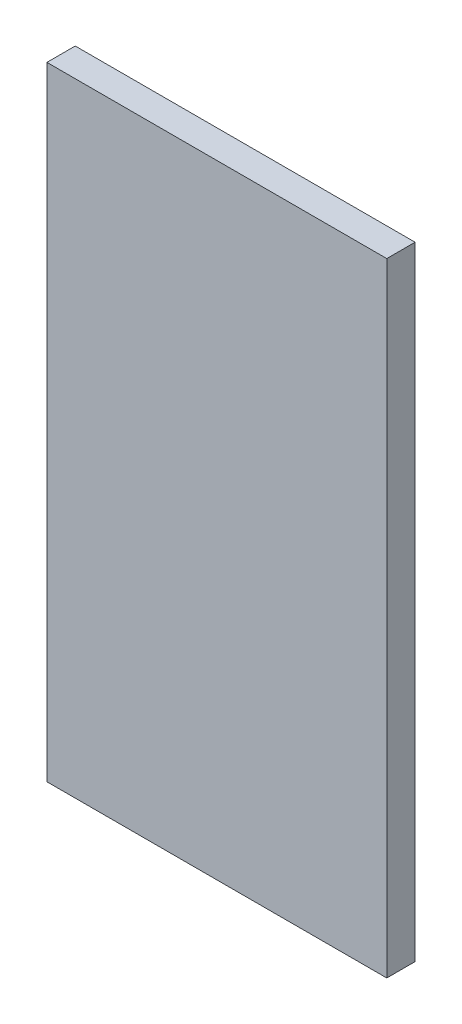
ISO-10303-21;
HEADER;
FILE_DESCRIPTION(('STEP AP214'),'2;1');
FILE_NAME('part.step','',(''),(''),'','','');
FILE_SCHEMA(('AUTOMOTIVE_DESIGN { 1 0 10303 214 1 1 1 1 }'));
ENDSEC;
DATA;
#1=APPLICATION_CONTEXT('core data for automotive mechanical design processes');
#2=APPLICATION_PROTOCOL_DEFINITION('international standard','automotive_design',2000,#1);
#3=PRODUCT_CONTEXT('',#1,'mechanical');
#4=PRODUCT('Part','Part','',(#3));
#5=PRODUCT_RELATED_PRODUCT_CATEGORY('part','',(#4));
#6=PRODUCT_DEFINITION_FORMATION('','',#4);
#7=PRODUCT_DEFINITION_CONTEXT('part definition',#1,'design');
#8=PRODUCT_DEFINITION('design','',#6,#7);
#9=PRODUCT_DEFINITION_SHAPE('','',#8);
#10=(LENGTH_UNIT() NAMED_UNIT(*) SI_UNIT(.MILLI.,.METRE.));
#11=(NAMED_UNIT(*) PLANE_ANGLE_UNIT() SI_UNIT($,.RADIAN.));
#12=(NAMED_UNIT(*) SI_UNIT($,.STERADIAN.) SOLID_ANGLE_UNIT());
#13=UNCERTAINTY_MEASURE_WITH_UNIT(LENGTH_MEASURE(1.E-05),#10,'distance_accuracy_value','');
#14=(GEOMETRIC_REPRESENTATION_CONTEXT(3) GLOBAL_UNCERTAINTY_ASSIGNED_CONTEXT((#13)) GLOBAL_UNIT_ASSIGNED_CONTEXT((#10,
#11,#12)) REPRESENTATION_CONTEXT('',''));
#15=CARTESIAN_POINT('',(0.,0.,0.));
#16=DIRECTION('',(0.,0.,1.));
#17=DIRECTION('',(1.,0.,0.));
#18=AXIS2_PLACEMENT_3D('',#15,#16,#17);
#19=CARTESIAN_POINT('',(0.,110.,0.));
#20=DIRECTION('',(1.,0.,0.));
#21=DIRECTION('',(0.,0.,-1.));
#22=AXIS2_PLACEMENT_3D('',#19,#20,#21);
#23=PLANE('',#22);
#24=DIRECTION('',(0.,0.,1.));
#25=VECTOR('',#24,1.);
#26=CARTESIAN_POINT('',(0.,0.,0.));
#27=LINE('',#26,#25);
#28=CARTESIAN_POINT('',(0.,0.,0.));
#29=VERTEX_POINT('',#28);
#30=CARTESIAN_POINT('',(0.,0.,5.));
#31=VERTEX_POINT('',#30);
#32=EDGE_CURVE('E95',#29,#31,#27,.T.);
#33=ORIENTED_EDGE('',*,*,#32,.T.);
#34=DIRECTION('',(0.,-1.,0.));
#35=VECTOR('',#34,1.);
#36=CARTESIAN_POINT('',(0.,110.,5.));
#37=LINE('',#36,#35);
#38=CARTESIAN_POINT('',(0.,110.,5.));
#39=VERTEX_POINT('',#38);
#40=EDGE_CURVE('E11',#39,#31,#37,.T.);
#41=ORIENTED_EDGE('',*,*,#40,.F.);
#42=DIRECTION('',(0.,0.,1.));
#43=VECTOR('',#42,1.);
#44=CARTESIAN_POINT('',(0.,110.,0.));
#45=LINE('',#44,#43);
#46=CARTESIAN_POINT('',(0.,110.,0.));
#47=VERTEX_POINT('',#46);
#48=EDGE_CURVE('E83',#47,#39,#45,.T.);
#49=ORIENTED_EDGE('',*,*,#48,.F.);
#50=DIRECTION('',(0.,-1.,0.));
#51=VECTOR('',#50,1.);
#52=CARTESIAN_POINT('',(0.,110.,0.));
#53=LINE('',#52,#51);
#54=EDGE_CURVE('E91',#47,#29,#53,.T.);
#55=ORIENTED_EDGE('',*,*,#54,.T.);
#56=EDGE_LOOP('',(#33,#41,#49,#55));
#57=FACE_BOUND('',#56,.T.);
#58=ADVANCED_FACE('F32',(#57),#23,.F.);
#59=CARTESIAN_POINT('',(0.,110.,5.));
#60=DIRECTION('',(0.,0.,-1.));
#61=DIRECTION('',(-1.,0.,0.));
#62=AXIS2_PLACEMENT_3D('',#59,#60,#61);
#63=PLANE('',#62);
#64=DIRECTION('',(1.,0.,0.));
#65=VECTOR('',#64,1.);
#66=CARTESIAN_POINT('',(0.,0.,5.));
#67=LINE('',#66,#65);
#68=CARTESIAN_POINT('',(60.,0.,5.));
#69=VERTEX_POINT('',#68);
#70=EDGE_CURVE('E87',#31,#69,#67,.T.);
#71=ORIENTED_EDGE('',*,*,#70,.T.);
#72=DIRECTION('',(0.,-1.,0.));
#73=VECTOR('',#72,1.);
#74=CARTESIAN_POINT('',(60.,110.,5.));
#75=LINE('',#74,#73);
#76=CARTESIAN_POINT('',(60.,110.,5.));
#77=VERTEX_POINT('',#76);
#78=EDGE_CURVE('E40',#77,#69,#75,.T.);
#79=ORIENTED_EDGE('',*,*,#78,.F.);
#80=DIRECTION('',(1.,0.,0.));
#81=VECTOR('',#80,1.);
#82=CARTESIAN_POINT('',(0.,110.,5.));
#83=LINE('',#82,#81);
#84=EDGE_CURVE('E78',#39,#77,#83,.T.);
#85=ORIENTED_EDGE('',*,*,#84,.F.);
#86=ORIENTED_EDGE('',*,*,#40,.T.);
#87=EDGE_LOOP('',(#71,#79,#85,#86));
#88=FACE_BOUND('',#87,.T.);
#89=ADVANCED_FACE('F86',(#88),#63,.F.);
#90=CARTESIAN_POINT('',(60.,110.,0.));
#91=DIRECTION('',(-1.,0.,0.));
#92=DIRECTION('',(0.,0.,1.));
#93=AXIS2_PLACEMENT_3D('',#90,#91,#92);
#94=PLANE('',#93);
#95=DIRECTION('',(0.,0.,-1.));
#96=VECTOR('',#95,1.);
#97=CARTESIAN_POINT('',(60.,0.,0.));
#98=LINE('',#97,#96);
#99=CARTESIAN_POINT('',(60.,0.,0.));
#100=VERTEX_POINT('',#99);
#101=EDGE_CURVE('E65',#69,#100,#98,.T.);
#102=ORIENTED_EDGE('',*,*,#101,.T.);
#103=DIRECTION('',(0.,-1.,0.));
#104=VECTOR('',#103,1.);
#105=CARTESIAN_POINT('',(60.,110.,0.));
#106=LINE('',#105,#104);
#107=CARTESIAN_POINT('',(60.,110.,0.));
#108=VERTEX_POINT('',#107);
#109=EDGE_CURVE('E88',#108,#100,#106,.T.);
#110=ORIENTED_EDGE('',*,*,#109,.F.);
#111=DIRECTION('',(0.,0.,-1.));
#112=VECTOR('',#111,1.);
#113=CARTESIAN_POINT('',(60.,110.,0.));
#114=LINE('',#113,#112);
#115=EDGE_CURVE('E81',#77,#108,#114,.T.);
#116=ORIENTED_EDGE('',*,*,#115,.F.);
#117=ORIENTED_EDGE('',*,*,#78,.T.);
#118=EDGE_LOOP('',(#102,#110,#116,#117));
#119=FACE_BOUND('',#118,.T.);
#120=ADVANCED_FACE('F89',(#119),#94,.F.);
#121=CARTESIAN_POINT('',(0.,110.,0.));
#122=DIRECTION('',(0.,0.,1.));
#123=DIRECTION('',(1.,0.,0.));
#124=AXIS2_PLACEMENT_3D('',#121,#122,#123);
#125=PLANE('',#124);
#126=DIRECTION('',(-1.,0.,0.));
#127=VECTOR('',#126,1.);
#128=CARTESIAN_POINT('',(0.,0.,0.));
#129=LINE('',#128,#127);
#130=EDGE_CURVE('E71',#100,#29,#129,.T.);
#131=ORIENTED_EDGE('',*,*,#130,.T.);
#132=ORIENTED_EDGE('',*,*,#54,.F.);
#133=DIRECTION('',(-1.,0.,0.));
#134=VECTOR('',#133,1.);
#135=CARTESIAN_POINT('',(0.,110.,0.));
#136=LINE('',#135,#134);
#137=EDGE_CURVE('E48',#108,#47,#136,.T.);
#138=ORIENTED_EDGE('',*,*,#137,.F.);
#139=ORIENTED_EDGE('',*,*,#109,.T.);
#140=EDGE_LOOP('',(#131,#132,#138,#139));
#141=FACE_BOUND('',#140,.T.);
#142=ADVANCED_FACE('F102',(#141),#125,.F.);
#143=CARTESIAN_POINT('',(0.,110.,0.));
#144=DIRECTION('',(0.,1.,0.));
#145=DIRECTION('',(0.,0.,1.));
#146=AXIS2_PLACEMENT_3D('',#143,#144,#145);
#147=PLANE('',#146);
#148=ORIENTED_EDGE('',*,*,#48,.T.);
#149=ORIENTED_EDGE('',*,*,#84,.T.);
#150=ORIENTED_EDGE('',*,*,#115,.T.);
#151=ORIENTED_EDGE('',*,*,#137,.T.);
#152=EDGE_LOOP('',(#148,#149,#150,#151));
#153=FACE_BOUND('',#152,.T.);
#154=ADVANCED_FACE('F79',(#153),#147,.T.);
#155=CARTESIAN_POINT('',(0.,0.,0.));
#156=DIRECTION('',(0.,1.,0.));
#157=DIRECTION('',(0.,0.,1.));
#158=AXIS2_PLACEMENT_3D('',#155,#156,#157);
#159=PLANE('',#158);
#160=ORIENTED_EDGE('',*,*,#32,.F.);
#161=ORIENTED_EDGE('',*,*,#130,.F.);
#162=ORIENTED_EDGE('',*,*,#101,.F.);
#163=ORIENTED_EDGE('',*,*,#70,.F.);
#164=EDGE_LOOP('',(#160,#161,#162,#163));
#165=FACE_BOUND('',#164,.T.);
#166=ADVANCED_FACE('F105',(#165),#159,.F.);
#167=CLOSED_SHELL('',(#58,#89,#120,#142,#154,#166));
#168=MANIFOLD_SOLID_BREP('B2',#167);
#169=ADVANCED_BREP_SHAPE_REPRESENTATION('',(#18,#168),#14);
#170=SHAPE_DEFINITION_REPRESENTATION(#9,#169);
ENDSEC;
END-ISO-10303-21;
